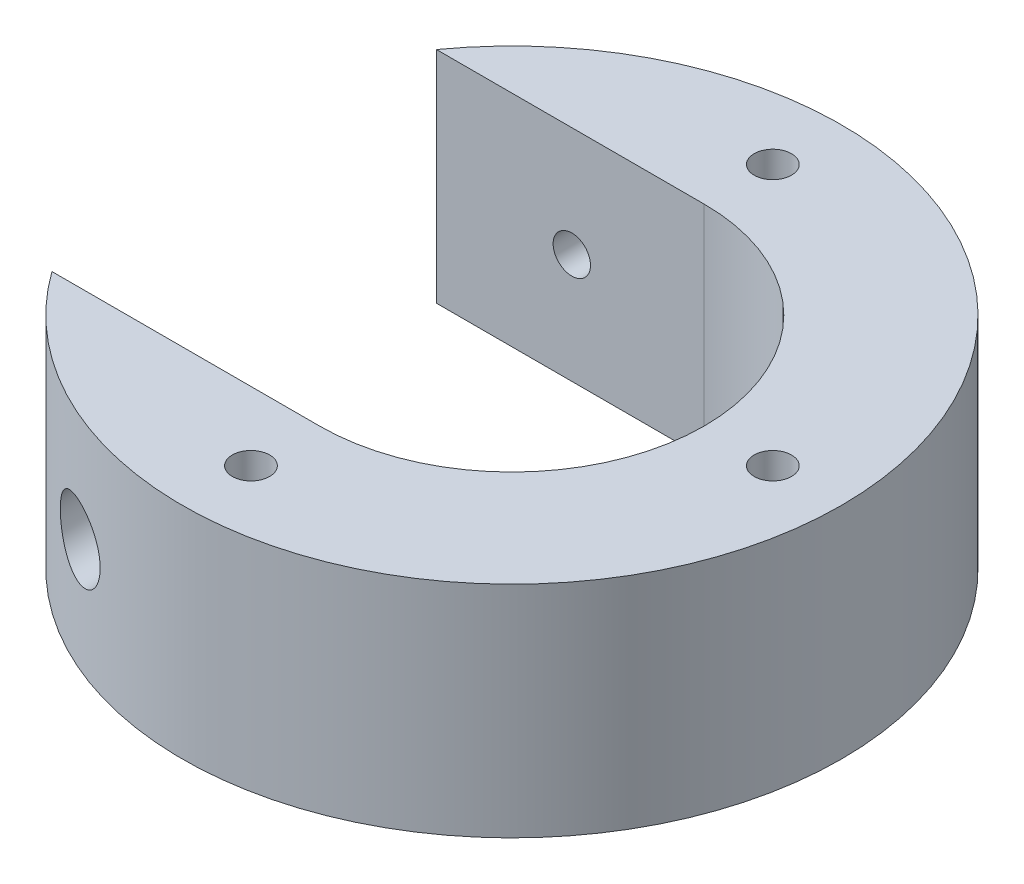
ISO-10303-21;
HEADER;
FILE_DESCRIPTION(('STEP AP214'),'2;1');
FILE_NAME('part.step','',(''),(''),'','','');
FILE_SCHEMA(('AUTOMOTIVE_DESIGN { 1 0 10303 214 1 1 1 1 }'));
ENDSEC;
DATA;
#1=APPLICATION_CONTEXT('core data for automotive mechanical design processes');
#2=APPLICATION_PROTOCOL_DEFINITION('international standard','automotive_design',2000,#1);
#3=PRODUCT_CONTEXT('',#1,'mechanical');
#4=PRODUCT('Part','Part','',(#3));
#5=PRODUCT_RELATED_PRODUCT_CATEGORY('part','',(#4));
#6=PRODUCT_DEFINITION_FORMATION('','',#4);
#7=PRODUCT_DEFINITION_CONTEXT('part definition',#1,'design');
#8=PRODUCT_DEFINITION('design','',#6,#7);
#9=PRODUCT_DEFINITION_SHAPE('','',#8);
#10=(LENGTH_UNIT() NAMED_UNIT(*) SI_UNIT(.MILLI.,.METRE.));
#11=(NAMED_UNIT(*) PLANE_ANGLE_UNIT() SI_UNIT($,.RADIAN.));
#12=(NAMED_UNIT(*) SI_UNIT($,.STERADIAN.) SOLID_ANGLE_UNIT());
#13=UNCERTAINTY_MEASURE_WITH_UNIT(LENGTH_MEASURE(1.E-05),#10,'distance_accuracy_value','');
#14=(GEOMETRIC_REPRESENTATION_CONTEXT(3) GLOBAL_UNCERTAINTY_ASSIGNED_CONTEXT((#13)) GLOBAL_UNIT_ASSIGNED_CONTEXT((#10,
#11,#12)) REPRESENTATION_CONTEXT('',''));
#15=CARTESIAN_POINT('',(0.,0.,0.));
#16=DIRECTION('',(0.,0.,1.));
#17=DIRECTION('',(1.,0.,0.));
#18=AXIS2_PLACEMENT_3D('',#15,#16,#17);
#19=CARTESIAN_POINT('',(0.,20.,0.));
#20=DIRECTION('',(0.,1.,0.));
#21=DIRECTION('',(0.,0.,1.));
#22=AXIS2_PLACEMENT_3D('',#19,#20,#21);
#23=PLANE('',#22);
#24=CARTESIAN_POINT('',(0.,20.,0.));
#25=DIRECTION('',(0.,1.,0.));
#26=DIRECTION('',(0.,0.,1.));
#27=AXIS2_PLACEMENT_3D('',#24,#25,#26);
#28=CIRCLE('',#27,30.);
#29=CARTESIAN_POINT('',(-24.3669858620224,20.,17.5));
#30=VERTEX_POINT('',#29);
#31=CARTESIAN_POINT('',(-24.3669858620224,20.,-17.5));
#32=VERTEX_POINT('',#31);
#33=EDGE_CURVE('E11',#30,#32,#28,.T.);
#34=ORIENTED_EDGE('',*,*,#33,.T.);
#35=DIRECTION('',(1.,0.,0.));
#36=VECTOR('',#35,1.);
#37=CARTESIAN_POINT('',(0.,20.,-17.5));
#38=LINE('',#37,#36);
#39=CARTESIAN_POINT('',(0.,20.,-17.5));
#40=VERTEX_POINT('',#39);
#41=EDGE_CURVE('E94',#32,#40,#38,.T.);
#42=ORIENTED_EDGE('',*,*,#41,.T.);
#43=CARTESIAN_POINT('',(0.,20.,0.));
#44=DIRECTION('',(0.,1.,0.));
#45=DIRECTION('',(0.,0.,1.));
#46=AXIS2_PLACEMENT_3D('',#43,#44,#45);
#47=CIRCLE('',#46,17.5);
#48=CARTESIAN_POINT('',(0.,20.,17.5));
#49=VERTEX_POINT('',#48);
#50=EDGE_CURVE('E104',#40,#49,#47,.F.);
#51=ORIENTED_EDGE('',*,*,#50,.T.);
#52=DIRECTION('',(1.,0.,0.));
#53=VECTOR('',#52,1.);
#54=CARTESIAN_POINT('',(0.,20.,17.5));
#55=LINE('',#54,#53);
#56=EDGE_CURVE('E114',#30,#49,#55,.T.);
#57=ORIENTED_EDGE('',*,*,#56,.F.);
#58=EDGE_LOOP('',(#34,#42,#51,#57));
#59=FACE_BOUND('',#58,.T.);
#60=CARTESIAN_POINT('',(0.,20.,-23.75));
#61=DIRECTION('',(0.,-1.,0.));
#62=DIRECTION('',(0.,0.,-1.));
#63=AXIS2_PLACEMENT_3D('',#60,#61,#62);
#64=CIRCLE('',#63,1.69999999999999);
#65=CARTESIAN_POINT('',(0.,20.,-25.45));
#66=VERTEX_POINT('',#65);
#67=EDGE_CURVE('E137',#66,#66,#64,.T.);
#68=ORIENTED_EDGE('',*,*,#67,.T.);
#69=EDGE_LOOP('',(#68));
#70=FACE_BOUND('',#69,.T.);
#71=CARTESIAN_POINT('',(23.75,20.,0.));
#72=DIRECTION('',(0.,-1.,0.));
#73=DIRECTION('',(0.,0.,-1.));
#74=AXIS2_PLACEMENT_3D('',#71,#72,#73);
#75=CIRCLE('',#74,1.69999999999999);
#76=CARTESIAN_POINT('',(23.75,20.,-1.69999999999999));
#77=VERTEX_POINT('',#76);
#78=EDGE_CURVE('E149',#77,#77,#75,.T.);
#79=ORIENTED_EDGE('',*,*,#78,.T.);
#80=EDGE_LOOP('',(#79));
#81=FACE_BOUND('',#80,.T.);
#82=CARTESIAN_POINT('',(0.,20.,23.75));
#83=DIRECTION('',(0.,-1.,0.));
#84=DIRECTION('',(0.,0.,-1.));
#85=AXIS2_PLACEMENT_3D('',#82,#83,#84);
#86=CIRCLE('',#85,1.69999999999999);
#87=CARTESIAN_POINT('',(0.,20.,22.05));
#88=VERTEX_POINT('',#87);
#89=EDGE_CURVE('E118',#88,#88,#86,.T.);
#90=ORIENTED_EDGE('',*,*,#89,.T.);
#91=EDGE_LOOP('',(#90));
#92=FACE_BOUND('',#91,.T.);
#93=ADVANCED_FACE('F43',(#59,#70,#81,#92),#23,.T.);
#94=CARTESIAN_POINT('',(0.,0.,0.));
#95=DIRECTION('',(0.,1.,0.));
#96=DIRECTION('',(0.,0.,1.));
#97=AXIS2_PLACEMENT_3D('',#94,#95,#96);
#98=PLANE('',#97);
#99=CARTESIAN_POINT('',(0.,0.,-23.75));
#100=DIRECTION('',(0.,-1.,0.));
#101=DIRECTION('',(0.,0.,-1.));
#102=AXIS2_PLACEMENT_3D('',#99,#100,#101);
#103=CIRCLE('',#102,1.725);
#104=CARTESIAN_POINT('',(0.,0.,-25.475));
#105=VERTEX_POINT('',#104);
#106=EDGE_CURVE('E110',#105,#105,#103,.T.);
#107=ORIENTED_EDGE('',*,*,#106,.F.);
#108=EDGE_LOOP('',(#107));
#109=FACE_BOUND('',#108,.T.);
#110=CARTESIAN_POINT('',(23.75,0.,0.));
#111=DIRECTION('',(0.,-1.,0.));
#112=DIRECTION('',(0.,0.,-1.));
#113=AXIS2_PLACEMENT_3D('',#110,#111,#112);
#114=CIRCLE('',#113,1.725);
#115=CARTESIAN_POINT('',(23.75,0.,-1.725));
#116=VERTEX_POINT('',#115);
#117=EDGE_CURVE('E141',#116,#116,#114,.T.);
#118=ORIENTED_EDGE('',*,*,#117,.F.);
#119=EDGE_LOOP('',(#118));
#120=FACE_BOUND('',#119,.T.);
#121=CARTESIAN_POINT('',(0.,0.,23.75));
#122=DIRECTION('',(0.,-1.,0.));
#123=DIRECTION('',(0.,0.,-1.));
#124=AXIS2_PLACEMENT_3D('',#121,#122,#123);
#125=CIRCLE('',#124,1.725);
#126=CARTESIAN_POINT('',(0.,0.,22.025));
#127=VERTEX_POINT('',#126);
#128=EDGE_CURVE('E153',#127,#127,#125,.T.);
#129=ORIENTED_EDGE('',*,*,#128,.F.);
#130=EDGE_LOOP('',(#129));
#131=FACE_BOUND('',#130,.T.);
#132=DIRECTION('',(1.,0.,0.));
#133=VECTOR('',#132,1.);
#134=CARTESIAN_POINT('',(0.,0.,-17.5));
#135=LINE('',#134,#133);
#136=CARTESIAN_POINT('',(-24.3669858620224,0.,-17.5));
#137=VERTEX_POINT('',#136);
#138=CARTESIAN_POINT('',(0.,0.,-17.5));
#139=VERTEX_POINT('',#138);
#140=EDGE_CURVE('E68',#137,#139,#135,.T.);
#141=ORIENTED_EDGE('',*,*,#140,.F.);
#142=CARTESIAN_POINT('',(0.,0.,0.));
#143=DIRECTION('',(0.,1.,0.));
#144=DIRECTION('',(0.,0.,1.));
#145=AXIS2_PLACEMENT_3D('',#142,#143,#144);
#146=CIRCLE('',#145,30.);
#147=CARTESIAN_POINT('',(-24.3669858620224,0.,17.5));
#148=VERTEX_POINT('',#147);
#149=EDGE_CURVE('E59',#148,#137,#146,.T.);
#150=ORIENTED_EDGE('',*,*,#149,.F.);
#151=DIRECTION('',(1.,0.,0.));
#152=VECTOR('',#151,1.);
#153=CARTESIAN_POINT('',(0.,0.,17.5));
#154=LINE('',#153,#152);
#155=CARTESIAN_POINT('',(0.,0.,17.5));
#156=VERTEX_POINT('',#155);
#157=EDGE_CURVE('E103',#148,#156,#154,.T.);
#158=ORIENTED_EDGE('',*,*,#157,.T.);
#159=CARTESIAN_POINT('',(0.,0.,0.));
#160=DIRECTION('',(0.,1.,0.));
#161=DIRECTION('',(0.,0.,1.));
#162=AXIS2_PLACEMENT_3D('',#159,#160,#161);
#163=CIRCLE('',#162,17.5);
#164=EDGE_CURVE('E166',#139,#156,#163,.F.);
#165=ORIENTED_EDGE('',*,*,#164,.F.);
#166=EDGE_LOOP('',(#141,#150,#158,#165));
#167=FACE_BOUND('',#166,.T.);
#168=ADVANCED_FACE('F233',(#109,#120,#131,#167),#98,.F.);
#169=CARTESIAN_POINT('',(0.,20.,0.));
#170=DIRECTION('',(0.,-1.,0.));
#171=DIRECTION('',(0.,0.,-1.));
#172=AXIS2_PLACEMENT_3D('',#169,#170,#171);
#173=CYLINDRICAL_SURFACE('',#172,30.);
#174=CARTESIAN_POINT('',(-15.2969858620224,10.,-25.8070188812479));
#175=CARTESIAN_POINT('',(-15.2969859340615,9.91739857448381,-25.8070187821705));
#176=CARTESIAN_POINT('',(-15.2938313195371,9.83480395677136,-25.8088896565349));
#177=CARTESIAN_POINT('',(-15.2812691470552,9.67025136899959,-25.816329291718));
#178=CARTESIAN_POINT('',(-15.2718595991448,9.58829360994894,-25.8218992293611));
#179=CARTESIAN_POINT('',(-15.2343728608325,9.34417679471965,-25.8440476042123));
#180=CARTESIAN_POINT('',(-15.1970376443802,9.18381108720318,-25.8660645443988));
#181=CARTESIAN_POINT('',(-15.0997924942252,8.87336947917239,-25.9229505464584));
#182=CARTESIAN_POINT('',(-15.0399696632729,8.7232564838625,-25.957770008249));
#183=CARTESIAN_POINT('',(-14.9003082997009,8.43584517919884,-26.038189022245));
#184=CARTESIAN_POINT('',(-14.8204688814624,8.2985474372152,-26.0837890514235));
#185=CARTESIAN_POINT('',(-14.6379930007011,8.03098356654614,-26.1866524958305));
#186=CARTESIAN_POINT('',(-14.5342444350232,7.90169164979141,-26.2444663569987));
#187=CARTESIAN_POINT('',(-14.3104322021602,7.66200326024154,-26.3671733219282));
#188=CARTESIAN_POINT('',(-14.1903615254633,7.55161495185734,-26.4320694647932));
#189=CARTESIAN_POINT('',(-13.9201978282535,7.33785977734722,-26.5754469024393));
#190=CARTESIAN_POINT('',(-13.7682322460791,7.23730286161255,-26.6545945710853));
#191=CARTESIAN_POINT('',(-13.4510099773248,7.06333889922654,-26.8160782582653));
#192=CARTESIAN_POINT('',(-13.2857464120489,6.98994601515745,-26.8984159153295));
#193=CARTESIAN_POINT('',(-12.9297199030707,6.86598860132161,-27.0714796125126));
#194=CARTESIAN_POINT('',(-12.7380168774543,6.81819562540757,-27.162271014976));
#195=CARTESIAN_POINT('',(-12.3481175994974,6.75797272392295,-27.3417275264944));
#196=CARTESIAN_POINT('',(-12.1499201451696,6.74554938237758,-27.4303922366221));
#197=CARTESIAN_POINT('',(-11.749581383977,6.75735979454625,-27.6042680740525));
#198=CARTESIAN_POINT('',(-11.5474246456784,6.78212939129508,-27.6894102052655));
#199=CARTESIAN_POINT('',(-11.148529932474,6.86999316131485,-27.8524086864818));
#200=CARTESIAN_POINT('',(-10.9517903859678,6.93307609426103,-27.9302671656266));
#201=CARTESIAN_POINT('',(-10.5811203603916,7.09272202109705,-28.0727136940084));
#202=CARTESIAN_POINT('',(-10.4065330614317,7.18732105306479,-28.1377879022971));
#203=CARTESIAN_POINT('',(-10.0753012739404,7.40874856819484,-28.2580848393824));
#204=CARTESIAN_POINT('',(-9.91864827733218,7.53556167623905,-28.3133122465148));
#205=CARTESIAN_POINT('',(-9.64049701308752,7.80766186726831,-28.4091696151848));
#206=CARTESIAN_POINT('',(-9.51725868752418,7.95089847042409,-28.4505754543485));
#207=CARTESIAN_POINT('',(-9.29659866478051,8.25827150850829,-28.5234429363588));
#208=CARTESIAN_POINT('',(-9.19916779953592,8.42240049068722,-28.5549081113802));
#209=CARTESIAN_POINT('',(-9.03878670999007,8.7567527354555,-28.6060666444355));
#210=CARTESIAN_POINT('',(-8.97419601795785,8.92610422363333,-28.6263258329982));
#211=CARTESIAN_POINT('',(-8.87395349732206,9.27397773807361,-28.6575598500407));
#212=CARTESIAN_POINT('',(-8.83829587383689,9.4524979203574,-28.6685365376917));
#213=CARTESIAN_POINT('',(-8.79789350183783,9.80785605489031,-28.6809606245914));
#214=CARTESIAN_POINT('',(-8.79225030968803,9.98458281538209,-28.6826849943693));
#215=CARTESIAN_POINT('',(-8.80965533481581,10.3364748430495,-28.6773439260352));
#216=CARTESIAN_POINT('',(-8.83270123951954,10.5116402349379,-28.6702791963959));
#217=CARTESIAN_POINT('',(-8.90636126705051,10.8540576060557,-28.6474812433018));
#218=CARTESIAN_POINT('',(-8.95676208480684,11.0213600701054,-28.631815080311));
#219=CARTESIAN_POINT('',(-9.08320753826633,11.3448729195863,-28.5919518007187));
#220=CARTESIAN_POINT('',(-9.15925248255885,11.5010831715116,-28.5677545814585));
#221=CARTESIAN_POINT('',(-9.33540526594524,11.8000813440401,-28.5106794815662));
#222=CARTESIAN_POINT('',(-9.43578705510394,11.9426886720412,-28.477702321151));
#223=CARTESIAN_POINT('',(-9.65671346801294,12.2088515035232,-28.403546116312));
#224=CARTESIAN_POINT('',(-9.77726034188155,12.3324048779108,-28.3623661564821));
#225=CARTESIAN_POINT('',(-10.0388871217435,12.5614944854785,-28.270842448733));
#226=CARTESIAN_POINT('',(-10.1805115228304,12.6663053816388,-28.2202420728396));
#227=CARTESIAN_POINT('',(-10.4766676829951,12.8508004898774,-28.1116400834364));
#228=CARTESIAN_POINT('',(-10.6312022683607,12.9304791817045,-28.053636847824));
#229=CARTESIAN_POINT('',(-10.9575374014838,13.0673456134137,-27.9278458311615));
#230=CARTESIAN_POINT('',(-11.1298201686755,13.1230472564791,-27.8596944857856));
#231=CARTESIAN_POINT('',(-11.4789529255738,13.2050002347404,-27.71766942433));
#232=CARTESIAN_POINT('',(-11.6558043710766,13.2312420612208,-27.6437938688729));
#233=CARTESIAN_POINT('',(-12.0220317526947,13.2554353432631,-27.4865993054418));
#234=CARTESIAN_POINT('',(-12.2114188120343,13.2512804535723,-27.4029811743148));
#235=CARTESIAN_POINT('',(-12.5855258282359,13.2105945920073,-27.233193074537));
#236=CARTESIAN_POINT('',(-12.7702441226551,13.174052250185,-27.1470222199959));
#237=CARTESIAN_POINT('',(-13.1411358267302,13.066712486603,-26.9695234902491));
#238=CARTESIAN_POINT('',(-13.3267677268175,12.994044430684,-26.8781874823211));
#239=CARTESIAN_POINT('',(-13.6829206450622,12.8153097898353,-26.6986427159267));
#240=CARTESIAN_POINT('',(-13.8534371709758,12.7092333183865,-26.6104348917888));
#241=CARTESIAN_POINT('',(-14.1743875965031,12.4652038632621,-26.440870829815));
#242=CARTESIAN_POINT('',(-14.3248109667964,12.3272342693802,-26.3595181924487));
#243=CARTESIAN_POINT('',(-14.5307838271206,12.0985284140731,-26.2461909584966));
#244=CARTESIAN_POINT('',(-14.5961968826824,12.0186148137724,-26.2098468103226));
#245=CARTESIAN_POINT('',(-14.719723505073,11.8519474424369,-26.140671924902));
#246=CARTESIAN_POINT('',(-14.7778417300279,11.7651980945896,-26.1078389475945));
#247=CARTESIAN_POINT('',(-14.8811022683755,11.5935475721854,-26.0491075777953));
#248=CARTESIAN_POINT('',(-14.9269426282168,11.5091881148796,-26.0228506251009));
#249=CARTESIAN_POINT('',(-15.0113159726843,11.3358621323672,-25.9742711409041));
#250=CARTESIAN_POINT('',(-15.0498534993882,11.2468985148994,-25.9519461644797));
#251=CARTESIAN_POINT('',(-15.1190001391266,11.0652022123562,-25.9117238766144));
#252=CARTESIAN_POINT('',(-15.1496264963302,10.9724782434759,-25.8938169389586));
#253=CARTESIAN_POINT('',(-15.2025369694935,10.7839488481412,-25.8627881752626));
#254=CARTESIAN_POINT('',(-15.2248257282936,10.6881451690166,-25.8496636861938));
#255=CARTESIAN_POINT('',(-15.2607107991941,10.4941827863938,-25.8284947817712));
#256=CARTESIAN_POINT('',(-15.2742910783285,10.3960200823573,-25.8204597367979));
#257=CARTESIAN_POINT('',(-15.2924284904867,10.1985682947448,-25.8097218909681));
#258=CARTESIAN_POINT('',(-15.2969857754381,10.0992792301625,-25.8070190003297));
#259=CARTESIAN_POINT('',(-15.2969858620224,10.,-25.8070188812479));
#260=B_SPLINE_CURVE_WITH_KNOTS('',3,(#174,#175,#176,#177,#178,#179,#180,#181,#182,#183,#184,
#185,#186,#187,#188,#189,#190,#191,#192,#193,#194,#195,#196,#197,#198,#199,#200,#201,#202,#203,
#204,#205,#206,#207,#208,#209,#210,#211,#212,#213,#214,#215,#216,#217,#218,#219,#220,#221,#222,
#223,#224,#225,#226,#227,#228,#229,#230,#231,#232,#233,#234,#235,#236,#237,#238,#239,#240,#241,
#242,#243,#244,#245,#246,#247,#248,#249,#250,#251,#252,#253,#254,#255,#256,#257,#258,#259),
.UNSPECIFIED.,.T.,.F.,(4,2,2,2,2,2,2,2,2,2,2,2,2,2,2,2,2,2,2,2,2,2,2,2,2,2,2,2,2,2,2,2,2,2,2,2,
2,2,2,2,2,2,4),(0.,0.247702116196247,0.49548307441353,0.991154122751766,1.48492471466314,
1.97871715693728,2.50333930186822,3.02818746115587,3.62172890614073,4.21557937291047,
4.86488146803572,5.51430442225429,6.1731738883886,6.83185014942776,7.4554146570445,
8.0786821074503,8.65601242610729,9.2331373730669,9.77757270325621,10.3218989638681,
10.8498358521197,11.3777301871325,11.9015660993507,12.4254083153887,12.9554459007865,
13.4855426698589,14.0330560528154,14.5806896126619,15.1585842581742,15.7366653765795,
16.3551657695817,16.9738833795494,17.6286261559064,18.2835628719866,18.9388414561888,
19.2668643584398,19.5946767238392,19.8928581077682,20.190853421389,20.4881935992657,
20.7853679541717,21.083087870415,21.3808027736615),.UNSPECIFIED.);
#261=CARTESIAN_POINT('',(-15.2969858620224,10.,-25.8070188812479));
#262=VERTEX_POINT('',#261);
#263=EDGE_CURVE('E48',#262,#262,#260,.T.);
#264=ORIENTED_EDGE('',*,*,#263,.T.);
#265=EDGE_LOOP('',(#264));
#266=FACE_BOUND('',#265,.T.);
#267=CARTESIAN_POINT('',(-8.7969858620224,10.,28.6812314893098));
#268=CARTESIAN_POINT('',(-8.79699443447112,9.82401154428674,28.6812303431146));
#269=CARTESIAN_POINT('',(-8.81133882200441,9.64789235347002,28.6768413753919));
#270=CARTESIAN_POINT('',(-8.86825103829739,9.30058235407611,28.6592912312116));
#271=CARTESIAN_POINT('',(-8.91085308003953,9.12939778258316,28.6461194208167));
#272=CARTESIAN_POINT('',(-9.02270546048117,8.79712458861181,28.6110851750029));
#273=CARTESIAN_POINT('',(-9.09192582405469,8.63602484595273,28.5892325142549));
#274=CARTESIAN_POINT('',(-9.25455618115442,8.32812899051905,28.5370013722723));
#275=CARTESIAN_POINT('',(-9.34796083547605,8.18132973043643,28.5066247727574));
#276=CARTESIAN_POINT('',(-9.55723123239168,7.90375374885878,28.437152008281));
#277=CARTESIAN_POINT('',(-9.67339074269182,7.77322770437152,28.3979406668986));
#278=CARTESIAN_POINT('',(-9.92345327247572,7.53360253773843,28.3115268378774));
#279=CARTESIAN_POINT('',(-10.0573594078016,7.42450718662894,28.2643229465514));
#280=CARTESIAN_POINT('',(-10.3445432501189,7.22585031490941,28.1605155726863));
#281=CARTESIAN_POINT('',(-10.4983899724419,7.13727265366111,28.1036061376124));
#282=CARTESIAN_POINT('',(-10.8161226345982,6.98696296785581,27.9828588279648));
#283=CARTESIAN_POINT('',(-10.9800111830676,6.92523795302128,27.9190191497205));
#284=CARTESIAN_POINT('',(-11.3237262297462,6.82614807403683,27.781460348934));
#285=CARTESIAN_POINT('',(-11.5039102229632,6.7905356785159,27.7073738035716));
#286=CARTESIAN_POINT('',(-11.8656702890262,6.74995525386689,27.5543915204421));
#287=CARTESIAN_POINT('',(-12.0472468090222,6.74499751931305,27.4754941760743));
#288=CARTESIAN_POINT('',(-12.4200249361472,6.76571861463035,27.3091094799407));
#289=CARTESIAN_POINT('',(-12.6110114743963,6.79356451066666,27.221407284898));
#290=CARTESIAN_POINT('',(-12.9847650322847,6.88230848081791,27.045122225139));
#291=CARTESIAN_POINT('',(-13.1675289941674,6.94321874245414,26.9565390475192));
#292=CARTESIAN_POINT('',(-13.5279985704336,7.10010637371814,26.7775179290516));
#293=CARTESIAN_POINT('',(-13.7051372005511,7.19749548222176,26.6871672378444));
#294=CARTESIAN_POINT('',(-14.0403218829312,7.42508505507352,26.5123581384981));
#295=CARTESIAN_POINT('',(-14.1983651381191,7.55529031770577,26.4279005943459));
#296=CARTESIAN_POINT('',(-14.4852734193059,7.84199248833948,26.2717095008594));
#297=CARTESIAN_POINT('',(-14.6148875831644,7.99755543458416,26.1996640274021));
#298=CARTESIAN_POINT('',(-14.7873574194974,8.24977646131861,26.1024607698086));
#299=CARTESIAN_POINT('',(-14.8411999138783,8.33702132139094,26.0718639829293));
#300=CARTESIAN_POINT('',(-14.9408637812641,8.51724986642851,26.0148779201383));
#301=CARTESIAN_POINT('',(-14.9866906446153,8.61022956377525,25.9884857653565));
#302=CARTESIAN_POINT('',(-15.0646796343379,8.78985639716651,25.9433462398071));
#303=CARTESIAN_POINT('',(-15.097817735562,8.87594708686236,25.9240634604216));
#304=CARTESIAN_POINT('',(-15.1568233943477,9.05133670493932,25.8896093499696));
#305=CARTESIAN_POINT('',(-15.1826953054005,9.14063367596725,25.8744355572261));
#306=CARTESIAN_POINT('',(-15.226772135643,9.32166874274966,25.8485215309946));
#307=CARTESIAN_POINT('',(-15.2449821370849,9.41340517729548,25.8377783587079));
#308=CARTESIAN_POINT('',(-15.2734518173576,9.59852344319436,25.8209594208007));
#309=CARTESIAN_POINT('',(-15.2837124602093,9.6919050736289,25.814883089232));
#310=CARTESIAN_POINT('',(-15.2953069403773,9.86729753460687,25.8080146819076));
#311=CARTESIAN_POINT('',(-15.2976208632889,9.94922270179062,25.8066424824546));
#312=CARTESIAN_POINT('',(-15.2960528250763,10.1130217801952,25.8075719381163));
#313=CARTESIAN_POINT('',(-15.2921688341083,10.1948956658352,25.8098747968287));
#314=CARTESIAN_POINT('',(-15.2782545579245,10.3578916328772,25.8181138707354));
#315=CARTESIAN_POINT('',(-15.268227683205,10.439014106108,25.8240480698269));
#316=CARTESIAN_POINT('',(-15.2421708012997,10.5999602135217,25.8394359814292));
#317=CARTESIAN_POINT('',(-15.226138523773,10.6797833445649,25.8488910249864));
#318=CARTESIAN_POINT('',(-15.1705970696413,10.9110712608833,25.8815538267636));
#319=CARTESIAN_POINT('',(-15.1231252201054,11.0600689921568,25.9093712069125));
#320=CARTESIAN_POINT('',(-15.008508700229,11.3475512502989,25.9759315029723));
#321=CARTESIAN_POINT('',(-14.9413596913538,11.4860334501544,26.0146768282694));
#322=CARTESIAN_POINT('',(-14.7840722354324,11.7600078262179,26.1044054351357));
#323=CARTESIAN_POINT('',(-14.6925868260166,11.8944959275846,26.1560888536315));
#324=CARTESIAN_POINT('',(-14.492635764993,12.1464401825174,26.2674057104725));
#325=CARTESIAN_POINT('',(-14.3841621805502,12.2638883294612,26.3270428609688));
#326=CARTESIAN_POINT('',(-14.1383519900299,12.4940957619802,26.4599484506562));
#327=CARTESIAN_POINT('',(-13.999099391582,12.6043663161825,26.5339862230927));
#328=CARTESIAN_POINT('',(-13.7062633450802,12.800062884834,26.6864316225391));
#329=CARTESIAN_POINT('',(-13.5526726046099,12.8854761648783,26.7648414649412));
#330=CARTESIAN_POINT('',(-13.2172183225548,13.0381894580891,26.9322096516371));
#331=CARTESIAN_POINT('',(-13.0340974797771,13.1025029965472,27.0213866700721));
#332=CARTESIAN_POINT('',(-12.6590285738809,13.1977117173655,27.1991193549223));
#333=CARTESIAN_POINT('',(-12.4670777795741,13.2285964864409,27.2876748191894));
#334=CARTESIAN_POINT('',(-12.0720763216702,13.2561442463949,27.4647678025339));
#335=CARTESIAN_POINT('',(-11.8688772795057,13.2515042578049,27.553184414644));
#336=CARTESIAN_POINT('',(-11.4643826374922,13.2038282325387,27.7239264148317));
#337=CARTESIAN_POINT('',(-11.2630867071489,13.1607989910835,27.8062528781242));
#338=CARTESIAN_POINT('',(-10.8770453753002,13.0386023033061,27.9594589595804));
#339=CARTESIAN_POINT('',(-10.6919604904142,12.9609187356679,28.0306609319826));
#340=CARTESIAN_POINT('',(-10.3367408428728,12.7709324043242,28.163588954286));
#341=CARTESIAN_POINT('',(-10.1665985210654,12.6586472760197,28.2253198073869));
#342=CARTESIAN_POINT('',(-9.85992126565228,12.4114665779285,28.333840751312));
#343=CARTESIAN_POINT('',(-9.72183843112789,12.278825517101,28.381393400426));
#344=CARTESIAN_POINT('',(-9.46988257221363,11.9894221190366,28.4664547993344));
#345=CARTESIAN_POINT('',(-9.35600637206949,11.8326629505972,28.5039648668184));
#346=CARTESIAN_POINT('',(-9.16347547264902,11.510270572103,28.5664200027429));
#347=CARTESIAN_POINT('',(-9.08306090777206,11.3458088833437,28.5920051175475));
#348=CARTESIAN_POINT('',(-8.95082957910123,11.00481138857,28.6336778729789));
#349=CARTESIAN_POINT('',(-8.89896907140514,10.8282945196977,28.6497800438221));
#350=CARTESIAN_POINT('',(-8.84064898889711,10.5420028587218,28.667811133853));
#351=CARTESIAN_POINT('',(-8.82430068841132,10.434332752522,28.6728416553473));
#352=CARTESIAN_POINT('',(-8.80246657004466,10.2177917757503,28.6795521575876));
#353=CARTESIAN_POINT('',(-8.79698055645247,10.1089209268483,28.6812321987009));
#354=CARTESIAN_POINT('',(-8.7969858620224,10.,28.6812314893098));
#355=B_SPLINE_CURVE_WITH_KNOTS('',3,(#267,#268,#269,#270,#271,#272,#273,#274,#275,#276,#277,
#278,#279,#280,#281,#282,#283,#284,#285,#286,#287,#288,#289,#290,#291,#292,#293,#294,#295,#296,
#297,#298,#299,#300,#301,#302,#303,#304,#305,#306,#307,#308,#309,#310,#311,#312,#313,#314,#315,
#316,#317,#318,#319,#320,#321,#322,#323,#324,#325,#326,#327,#328,#329,#330,#331,#332,#333,#334,
#335,#336,#337,#338,#339,#340,#341,#342,#343,#344,#345,#346,#347,#348,#349,#350,#351,#352,#353,
#354),.UNSPECIFIED.,.T.,.F.,(4,2,2,2,2,2,2,2,2,2,2,2,2,2,2,2,2,2,2,2,2,2,2,2,2,2,2,2,2,2,2,2,2,
2,2,2,2,2,2,2,2,2,2,4),(0.,0.527560437245169,1.0557607875983,1.58336806056311,2.11085895199777,
2.64567148652685,3.18057804482051,3.73740793993414,4.29438310506122,4.885975403995,
5.47776636310042,6.11094894945552,6.74436508547324,7.40536838578766,8.06646839224054,
8.70719378077538,9.02772281605992,9.34803143622943,9.63035880122766,9.91251664897346,
10.194487041268,10.4764232335824,10.7220221998582,10.9677016173829,11.2132447584665,
11.4588808209139,11.9331333890851,12.4074906020034,12.9174417839064,13.4276318076647,
14.0026000723562,14.5778623773899,15.2157865069698,15.8539092970333,16.51554634927,
17.1770663094082,17.8126355913525,18.4478814765328,19.0366635816299,19.6253683945741,
20.1771850847037,20.7281540403348,21.0546720890165,21.3811842546035),.UNSPECIFIED.);
#356=CARTESIAN_POINT('',(-8.7969858620224,10.,28.6812314893098));
#357=VERTEX_POINT('',#356);
#358=EDGE_CURVE('E123',#357,#357,#355,.T.);
#359=ORIENTED_EDGE('',*,*,#358,.T.);
#360=EDGE_LOOP('',(#359));
#361=FACE_BOUND('',#360,.T.);
#362=ORIENTED_EDGE('',*,*,#149,.T.);
#363=DIRECTION('',(0.,1.,0.));
#364=VECTOR('',#363,1.);
#365=CARTESIAN_POINT('',(-24.3669858620224,0.,-17.5));
#366=LINE('',#365,#364);
#367=EDGE_CURVE('E97',#137,#32,#366,.T.);
#368=ORIENTED_EDGE('',*,*,#367,.T.);
#369=ORIENTED_EDGE('',*,*,#33,.F.);
#370=DIRECTION('',(0.,1.,0.));
#371=VECTOR('',#370,1.);
#372=CARTESIAN_POINT('',(-24.3669858620224,0.,17.5));
#373=LINE('',#372,#371);
#374=EDGE_CURVE('E111',#148,#30,#373,.T.);
#375=ORIENTED_EDGE('',*,*,#374,.F.);
#376=EDGE_LOOP('',(#362,#368,#369,#375));
#377=FACE_BOUND('',#376,.T.);
#378=ADVANCED_FACE('F45',(#266,#361,#377),#173,.T.);
#379=CARTESIAN_POINT('',(0.,0.,-17.5));
#380=DIRECTION('',(0.,0.,1.));
#381=DIRECTION('',(1.,0.,0.));
#382=AXIS2_PLACEMENT_3D('',#379,#380,#381);
#383=PLANE('',#382);
#384=CARTESIAN_POINT('',(-12.0469858620224,10.,-17.5));
#385=DIRECTION('',(0.,0.,1.));
#386=DIRECTION('',(1.,0.,0.));
#387=AXIS2_PLACEMENT_3D('',#384,#385,#386);
#388=CIRCLE('',#387,1.7);
#389=CARTESIAN_POINT('',(-10.3469858620224,10.,-17.5));
#390=VERTEX_POINT('',#389);
#391=EDGE_CURVE('E258',#390,#390,#388,.T.);
#392=ORIENTED_EDGE('',*,*,#391,.F.);
#393=EDGE_LOOP('',(#392));
#394=FACE_BOUND('',#393,.T.);
#395=ORIENTED_EDGE('',*,*,#41,.F.);
#396=ORIENTED_EDGE('',*,*,#367,.F.);
#397=ORIENTED_EDGE('',*,*,#140,.T.);
#398=DIRECTION('',(0.,1.,0.));
#399=VECTOR('',#398,1.);
#400=CARTESIAN_POINT('',(0.,0.,-17.5));
#401=LINE('',#400,#399);
#402=EDGE_CURVE('E99',#139,#40,#401,.T.);
#403=ORIENTED_EDGE('',*,*,#402,.T.);
#404=EDGE_LOOP('',(#395,#396,#397,#403));
#405=FACE_BOUND('',#404,.T.);
#406=ADVANCED_FACE('F96',(#394,#405),#383,.T.);
#407=CARTESIAN_POINT('',(0.,0.,0.));
#408=DIRECTION('',(0.,1.,0.));
#409=DIRECTION('',(0.,0.,1.));
#410=AXIS2_PLACEMENT_3D('',#407,#408,#409);
#411=CYLINDRICAL_SURFACE('',#410,17.5);
#412=ORIENTED_EDGE('',*,*,#50,.F.);
#413=ORIENTED_EDGE('',*,*,#402,.F.);
#414=ORIENTED_EDGE('',*,*,#164,.T.);
#415=DIRECTION('',(0.,1.,0.));
#416=VECTOR('',#415,1.);
#417=CARTESIAN_POINT('',(0.,0.,17.5));
#418=LINE('',#417,#416);
#419=EDGE_CURVE('E79',#156,#49,#418,.T.);
#420=ORIENTED_EDGE('',*,*,#419,.T.);
#421=EDGE_LOOP('',(#412,#413,#414,#420));
#422=FACE_BOUND('',#421,.T.);
#423=ADVANCED_FACE('F225',(#422),#411,.F.);
#424=CARTESIAN_POINT('',(0.,0.,17.5));
#425=DIRECTION('',(0.,0.,1.));
#426=DIRECTION('',(1.,0.,0.));
#427=AXIS2_PLACEMENT_3D('',#424,#425,#426);
#428=PLANE('',#427);
#429=CARTESIAN_POINT('',(-12.0469858620224,10.,17.5));
#430=DIRECTION('',(0.,0.,1.));
#431=DIRECTION('',(1.,0.,0.));
#432=AXIS2_PLACEMENT_3D('',#429,#430,#431);
#433=CIRCLE('',#432,1.7);
#434=CARTESIAN_POINT('',(-10.3469858620224,10.,17.5));
#435=VERTEX_POINT('',#434);
#436=EDGE_CURVE('E127',#435,#435,#433,.T.);
#437=ORIENTED_EDGE('',*,*,#436,.T.);
#438=EDGE_LOOP('',(#437));
#439=FACE_BOUND('',#438,.T.);
#440=ORIENTED_EDGE('',*,*,#56,.T.);
#441=ORIENTED_EDGE('',*,*,#419,.F.);
#442=ORIENTED_EDGE('',*,*,#157,.F.);
#443=ORIENTED_EDGE('',*,*,#374,.T.);
#444=EDGE_LOOP('',(#440,#441,#442,#443));
#445=FACE_BOUND('',#444,.T.);
#446=ADVANCED_FACE('F120',(#439,#445),#428,.F.);
#447=CARTESIAN_POINT('',(0.,0.,23.75));
#448=DIRECTION('',(0.,-1.,0.));
#449=DIRECTION('',(0.,0.,-1.));
#450=AXIS2_PLACEMENT_3D('',#447,#448,#449);
#451=CYLINDRICAL_SURFACE('',#450,1.7);
#452=ORIENTED_EDGE('',*,*,#89,.F.);
#453=EDGE_LOOP('',(#452));
#454=FACE_BOUND('',#453,.T.);
#455=CARTESIAN_POINT('',(0.,0.0250000000000042,23.75));
#456=DIRECTION('',(0.,-1.,0.));
#457=DIRECTION('',(0.,0.,-1.));
#458=AXIS2_PLACEMENT_3D('',#455,#456,#457);
#459=CIRCLE('',#458,1.7);
#460=CARTESIAN_POINT('',(0.,0.0250000000000042,22.05));
#461=VERTEX_POINT('',#460);
#462=EDGE_CURVE('E157',#461,#461,#459,.T.);
#463=ORIENTED_EDGE('',*,*,#462,.T.);
#464=EDGE_LOOP('',(#463));
#465=FACE_BOUND('',#464,.T.);
#466=ADVANCED_FACE('F218',(#454,#465),#451,.F.);
#467=CARTESIAN_POINT('',(0.,0.,23.75));
#468=DIRECTION('',(0.,-1.,0.));
#469=DIRECTION('',(0.,0.,-1.));
#470=AXIS2_PLACEMENT_3D('',#467,#468,#469);
#471=CONICAL_SURFACE('',#470,1.725,0.785398163397422);
#472=ORIENTED_EDGE('',*,*,#462,.F.);
#473=EDGE_LOOP('',(#472));
#474=FACE_BOUND('',#473,.T.);
#475=ORIENTED_EDGE('',*,*,#128,.T.);
#476=EDGE_LOOP('',(#475));
#477=FACE_BOUND('',#476,.T.);
#478=ADVANCED_FACE('F214',(#474,#477),#471,.F.);
#479=CARTESIAN_POINT('',(23.75,0.,0.));
#480=DIRECTION('',(0.,-1.,0.));
#481=DIRECTION('',(0.,0.,-1.));
#482=AXIS2_PLACEMENT_3D('',#479,#480,#481);
#483=CYLINDRICAL_SURFACE('',#482,1.69999999999999);
#484=ORIENTED_EDGE('',*,*,#78,.F.);
#485=EDGE_LOOP('',(#484));
#486=FACE_BOUND('',#485,.T.);
#487=CARTESIAN_POINT('',(23.75,0.0250000000000042,0.));
#488=DIRECTION('',(0.,-1.,0.));
#489=DIRECTION('',(0.,0.,-1.));
#490=AXIS2_PLACEMENT_3D('',#487,#488,#489);
#491=CIRCLE('',#490,1.7);
#492=CARTESIAN_POINT('',(23.75,0.0250000000000042,-1.7));
#493=VERTEX_POINT('',#492);
#494=EDGE_CURVE('E145',#493,#493,#491,.T.);
#495=ORIENTED_EDGE('',*,*,#494,.T.);
#496=EDGE_LOOP('',(#495));
#497=FACE_BOUND('',#496,.T.);
#498=ADVANCED_FACE('F210',(#486,#497),#483,.F.);
#499=CARTESIAN_POINT('',(23.75,0.,0.));
#500=DIRECTION('',(0.,-1.,0.));
#501=DIRECTION('',(0.,0.,-1.));
#502=AXIS2_PLACEMENT_3D('',#499,#500,#501);
#503=CONICAL_SURFACE('',#502,1.725,0.785398163397448);
#504=ORIENTED_EDGE('',*,*,#494,.F.);
#505=EDGE_LOOP('',(#504));
#506=FACE_BOUND('',#505,.T.);
#507=ORIENTED_EDGE('',*,*,#117,.T.);
#508=EDGE_LOOP('',(#507));
#509=FACE_BOUND('',#508,.T.);
#510=ADVANCED_FACE('F206',(#506,#509),#503,.F.);
#511=CARTESIAN_POINT('',(0.,0.,-23.75));
#512=DIRECTION('',(0.,-1.,0.));
#513=DIRECTION('',(0.,0.,-1.));
#514=AXIS2_PLACEMENT_3D('',#511,#512,#513);
#515=CYLINDRICAL_SURFACE('',#514,1.7);
#516=ORIENTED_EDGE('',*,*,#67,.F.);
#517=EDGE_LOOP('',(#516));
#518=FACE_BOUND('',#517,.T.);
#519=CARTESIAN_POINT('',(0.,0.0250000000000042,-23.75));
#520=DIRECTION('',(0.,-1.,0.));
#521=DIRECTION('',(0.,0.,-1.));
#522=AXIS2_PLACEMENT_3D('',#519,#520,#521);
#523=CIRCLE('',#522,1.7);
#524=CARTESIAN_POINT('',(0.,0.0250000000000042,-25.45));
#525=VERTEX_POINT('',#524);
#526=EDGE_CURVE('E133',#525,#525,#523,.T.);
#527=ORIENTED_EDGE('',*,*,#526,.T.);
#528=EDGE_LOOP('',(#527));
#529=FACE_BOUND('',#528,.T.);
#530=ADVANCED_FACE('F202',(#518,#529),#515,.F.);
#531=CARTESIAN_POINT('',(0.,0.,-23.75));
#532=DIRECTION('',(0.,-1.,0.));
#533=DIRECTION('',(0.,0.,-1.));
#534=AXIS2_PLACEMENT_3D('',#531,#532,#533);
#535=CONICAL_SURFACE('',#534,1.725,0.785398163397422);
#536=ORIENTED_EDGE('',*,*,#526,.F.);
#537=EDGE_LOOP('',(#536));
#538=FACE_BOUND('',#537,.T.);
#539=ORIENTED_EDGE('',*,*,#106,.T.);
#540=EDGE_LOOP('',(#539));
#541=FACE_BOUND('',#540,.T.);
#542=ADVANCED_FACE('F188',(#538,#541),#535,.F.);
#543=CARTESIAN_POINT('',(-12.0469858620224,10.,30.));
#544=DIRECTION('',(0.,0.,1.));
#545=DIRECTION('',(1.,0.,0.));
#546=AXIS2_PLACEMENT_3D('',#543,#544,#545);
#547=CYLINDRICAL_SURFACE('',#546,3.25);
#548=CARTESIAN_POINT('',(-12.0469858620224,10.,23.));
#549=DIRECTION('',(0.,0.,1.));
#550=DIRECTION('',(1.,0.,0.));
#551=AXIS2_PLACEMENT_3D('',#548,#549,#550);
#552=CIRCLE('',#551,3.25);
#553=CARTESIAN_POINT('',(-8.7969858620224,10.,23.));
#554=VERTEX_POINT('',#553);
#555=EDGE_CURVE('E257',#554,#554,#552,.T.);
#556=ORIENTED_EDGE('',*,*,#555,.F.);
#557=EDGE_LOOP('',(#556));
#558=FACE_BOUND('',#557,.T.);
#559=ORIENTED_EDGE('',*,*,#358,.F.);
#560=EDGE_LOOP('',(#559));
#561=FACE_BOUND('',#560,.T.);
#562=ADVANCED_FACE('F182',(#558,#561),#547,.F.);
#563=CARTESIAN_POINT('',(-12.0469858620224,10.,30.));
#564=DIRECTION('',(0.,0.,1.));
#565=DIRECTION('',(1.,0.,0.));
#566=AXIS2_PLACEMENT_3D('',#563,#564,#565);
#567=CYLINDRICAL_SURFACE('',#566,1.7);
#568=ORIENTED_EDGE('',*,*,#436,.F.);
#569=EDGE_LOOP('',(#568));
#570=FACE_BOUND('',#569,.T.);
#571=CARTESIAN_POINT('',(-12.0469858620224,10.,23.));
#572=DIRECTION('',(0.,0.,1.));
#573=DIRECTION('',(1.,0.,0.));
#574=AXIS2_PLACEMENT_3D('',#571,#572,#573);
#575=CIRCLE('',#574,1.7);
#576=CARTESIAN_POINT('',(-10.3469858620224,10.,23.));
#577=VERTEX_POINT('',#576);
#578=EDGE_CURVE('E262',#577,#577,#575,.T.);
#579=ORIENTED_EDGE('',*,*,#578,.T.);
#580=EDGE_LOOP('',(#579));
#581=FACE_BOUND('',#580,.T.);
#582=ADVANCED_FACE('F187',(#570,#581),#567,.F.);
#583=CARTESIAN_POINT('',(-8.7969858620224,10.,23.));
#584=DIRECTION('',(0.,0.,-1.));
#585=DIRECTION('',(-1.,0.,0.));
#586=AXIS2_PLACEMENT_3D('',#583,#584,#585);
#587=PLANE('',#586);
#588=ORIENTED_EDGE('',*,*,#578,.F.);
#589=EDGE_LOOP('',(#588));
#590=FACE_BOUND('',#589,.T.);
#591=ORIENTED_EDGE('',*,*,#555,.T.);
#592=EDGE_LOOP('',(#591));
#593=FACE_BOUND('',#592,.T.);
#594=ADVANCED_FACE('F192',(#590,#593),#587,.F.);
#595=CARTESIAN_POINT('',(-12.0469858620224,10.,-30.));
#596=DIRECTION('',(0.,0.,-1.));
#597=DIRECTION('',(-1.,0.,0.));
#598=AXIS2_PLACEMENT_3D('',#595,#596,#597);
#599=CYLINDRICAL_SURFACE('',#598,3.25);
#600=CARTESIAN_POINT('',(-12.0469858620224,10.,-23.));
#601=DIRECTION('',(0.,0.,-1.));
#602=DIRECTION('',(-1.,0.,0.));
#603=AXIS2_PLACEMENT_3D('',#600,#601,#602);
#604=CIRCLE('',#603,3.25);
#605=CARTESIAN_POINT('',(-15.2969858620224,10.,-23.));
#606=VERTEX_POINT('',#605);
#607=EDGE_CURVE('E271',#606,#606,#604,.T.);
#608=ORIENTED_EDGE('',*,*,#607,.F.);
#609=EDGE_LOOP('',(#608));
#610=FACE_BOUND('',#609,.T.);
#611=ORIENTED_EDGE('',*,*,#263,.F.);
#612=EDGE_LOOP('',(#611));
#613=FACE_BOUND('',#612,.T.);
#614=ADVANCED_FACE('F195',(#610,#613),#599,.F.);
#615=CARTESIAN_POINT('',(-12.0469858620224,10.,-30.));
#616=DIRECTION('',(0.,0.,-1.));
#617=DIRECTION('',(-1.,0.,0.));
#618=AXIS2_PLACEMENT_3D('',#615,#616,#617);
#619=CYLINDRICAL_SURFACE('',#618,1.7);
#620=CARTESIAN_POINT('',(-12.0469858620224,10.,-23.));
#621=DIRECTION('',(0.,0.,-1.));
#622=DIRECTION('',(-1.,0.,0.));
#623=AXIS2_PLACEMENT_3D('',#620,#621,#622);
#624=CIRCLE('',#623,1.7);
#625=CARTESIAN_POINT('',(-13.7469858620224,10.,-23.));
#626=VERTEX_POINT('',#625);
#627=EDGE_CURVE('E265',#626,#626,#624,.T.);
#628=ORIENTED_EDGE('',*,*,#627,.T.);
#629=EDGE_LOOP('',(#628));
#630=FACE_BOUND('',#629,.T.);
#631=ORIENTED_EDGE('',*,*,#391,.T.);
#632=EDGE_LOOP('',(#631));
#633=FACE_BOUND('',#632,.T.);
#634=ADVANCED_FACE('F190',(#630,#633),#619,.F.);
#635=CARTESIAN_POINT('',(-8.7969858620224,10.,-23.));
#636=DIRECTION('',(0.,0.,1.));
#637=DIRECTION('',(1.,0.,0.));
#638=AXIS2_PLACEMENT_3D('',#635,#636,#637);
#639=PLANE('',#638);
#640=ORIENTED_EDGE('',*,*,#627,.F.);
#641=EDGE_LOOP('',(#640));
#642=FACE_BOUND('',#641,.T.);
#643=ORIENTED_EDGE('',*,*,#607,.T.);
#644=EDGE_LOOP('',(#643));
#645=FACE_BOUND('',#644,.T.);
#646=ADVANCED_FACE('F288',(#642,#645),#639,.F.);
#647=CLOSED_SHELL('',(#93,#168,#378,#406,#423,#446,#466,#478,#498,#510,#530,#542,#562,#582,#594,
#614,#634,#646));
#648=MANIFOLD_SOLID_BREP('B2',#647);
#649=ADVANCED_BREP_SHAPE_REPRESENTATION('',(#18,#648),#14);
#650=SHAPE_DEFINITION_REPRESENTATION(#9,#649);
ENDSEC;
END-ISO-10303-21;
